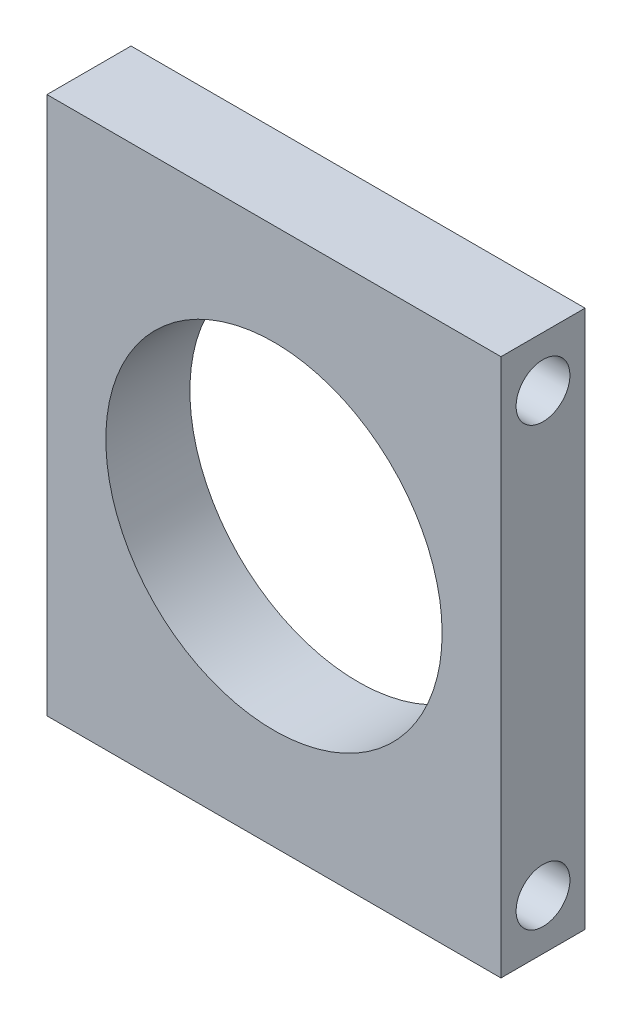
ISO-10303-21;
HEADER;
FILE_DESCRIPTION(('STEP AP214'),'2;1');
FILE_NAME('part.step','',(''),(''),'','','');
FILE_SCHEMA(('AUTOMOTIVE_DESIGN { 1 0 10303 214 1 1 1 1 }'));
ENDSEC;
DATA;
#1=APPLICATION_CONTEXT('core data for automotive mechanical design processes');
#2=APPLICATION_PROTOCOL_DEFINITION('international standard','automotive_design',2000,#1);
#3=PRODUCT_CONTEXT('',#1,'mechanical');
#4=PRODUCT('Part','Part','',(#3));
#5=PRODUCT_RELATED_PRODUCT_CATEGORY('part','',(#4));
#6=PRODUCT_DEFINITION_FORMATION('','',#4);
#7=PRODUCT_DEFINITION_CONTEXT('part definition',#1,'design');
#8=PRODUCT_DEFINITION('design','',#6,#7);
#9=PRODUCT_DEFINITION_SHAPE('','',#8);
#10=(LENGTH_UNIT() NAMED_UNIT(*) SI_UNIT(.MILLI.,.METRE.));
#11=(NAMED_UNIT(*) PLANE_ANGLE_UNIT() SI_UNIT($,.RADIAN.));
#12=(NAMED_UNIT(*) SI_UNIT($,.STERADIAN.) SOLID_ANGLE_UNIT());
#13=UNCERTAINTY_MEASURE_WITH_UNIT(LENGTH_MEASURE(1.E-05),#10,'distance_accuracy_value','');
#14=(GEOMETRIC_REPRESENTATION_CONTEXT(3) GLOBAL_UNCERTAINTY_ASSIGNED_CONTEXT((#13)) GLOBAL_UNIT_ASSIGNED_CONTEXT((#10,
#11,#12)) REPRESENTATION_CONTEXT('',''));
#15=CARTESIAN_POINT('',(0.,0.,0.));
#16=DIRECTION('',(0.,0.,1.));
#17=DIRECTION('',(1.,0.,0.));
#18=AXIS2_PLACEMENT_3D('',#15,#16,#17);
#19=CARTESIAN_POINT('',(0.,0.,5.));
#20=DIRECTION('',(1.,0.,0.));
#21=DIRECTION('',(0.,1.,0.));
#22=AXIS2_PLACEMENT_3D('',#19,#20,#21);
#23=PLANE('',#22);
#24=CARTESIAN_POINT('',(0.,-3.,2.5));
#25=DIRECTION('',(-1.,0.,0.));
#26=DIRECTION('',(0.,-1.,0.));
#27=AXIS2_PLACEMENT_3D('',#24,#25,#26);
#28=CIRCLE('',#27,1.6);
#29=CARTESIAN_POINT('',(0.,-4.6,2.5));
#30=VERTEX_POINT('',#29);
#31=EDGE_CURVE('E117',#30,#30,#28,.T.);
#32=ORIENTED_EDGE('',*,*,#31,.F.);
#33=EDGE_LOOP('',(#32));
#34=FACE_BOUND('',#33,.T.);
#35=CARTESIAN_POINT('',(0.,-29.,2.5));
#36=DIRECTION('',(-1.,0.,0.));
#37=DIRECTION('',(0.,-1.,0.));
#38=AXIS2_PLACEMENT_3D('',#35,#36,#37);
#39=CIRCLE('',#38,1.6);
#40=CARTESIAN_POINT('',(0.,-30.6,2.5));
#41=VERTEX_POINT('',#40);
#42=EDGE_CURVE('E122',#41,#41,#39,.T.);
#43=ORIENTED_EDGE('',*,*,#42,.F.);
#44=EDGE_LOOP('',(#43));
#45=FACE_BOUND('',#44,.T.);
#46=DIRECTION('',(0.,-1.,0.));
#47=VECTOR('',#46,1.);
#48=CARTESIAN_POINT('',(0.,0.,0.));
#49=LINE('',#48,#47);
#50=CARTESIAN_POINT('',(0.,0.,0.));
#51=VERTEX_POINT('',#50);
#52=CARTESIAN_POINT('',(0.,-32.,0.));
#53=VERTEX_POINT('',#52);
#54=EDGE_CURVE('E104',#51,#53,#49,.T.);
#55=ORIENTED_EDGE('',*,*,#54,.T.);
#56=DIRECTION('',(0.,0.,-1.));
#57=VECTOR('',#56,1.);
#58=CARTESIAN_POINT('',(0.,-32.,5.));
#59=LINE('',#58,#57);
#60=CARTESIAN_POINT('',(0.,-32.,5.));
#61=VERTEX_POINT('',#60);
#62=EDGE_CURVE('E11',#61,#53,#59,.T.);
#63=ORIENTED_EDGE('',*,*,#62,.F.);
#64=DIRECTION('',(0.,-1.,0.));
#65=VECTOR('',#64,1.);
#66=CARTESIAN_POINT('',(0.,0.,5.));
#67=LINE('',#66,#65);
#68=CARTESIAN_POINT('',(0.,0.,5.));
#69=VERTEX_POINT('',#68);
#70=EDGE_CURVE('E91',#69,#61,#67,.T.);
#71=ORIENTED_EDGE('',*,*,#70,.F.);
#72=DIRECTION('',(0.,0.,-1.));
#73=VECTOR('',#72,1.);
#74=CARTESIAN_POINT('',(0.,0.,5.));
#75=LINE('',#74,#73);
#76=EDGE_CURVE('E100',#69,#51,#75,.T.);
#77=ORIENTED_EDGE('',*,*,#76,.T.);
#78=EDGE_LOOP('',(#55,#63,#71,#77));
#79=FACE_BOUND('',#78,.T.);
#80=ADVANCED_FACE('F38',(#34,#45,#79),#23,.F.);
#81=CARTESIAN_POINT('',(0.,-32.,5.));
#82=DIRECTION('',(0.,1.,0.));
#83=DIRECTION('',(0.,0.,1.));
#84=AXIS2_PLACEMENT_3D('',#81,#82,#83);
#85=PLANE('',#84);
#86=DIRECTION('',(1.,0.,0.));
#87=VECTOR('',#86,1.);
#88=CARTESIAN_POINT('',(0.,-32.,0.));
#89=LINE('',#88,#87);
#90=CARTESIAN_POINT('',(27.,-32.,0.));
#91=VERTEX_POINT('',#90);
#92=EDGE_CURVE('E95',#53,#91,#89,.T.);
#93=ORIENTED_EDGE('',*,*,#92,.T.);
#94=DIRECTION('',(0.,0.,-1.));
#95=VECTOR('',#94,1.);
#96=CARTESIAN_POINT('',(27.,-32.,5.));
#97=LINE('',#96,#95);
#98=CARTESIAN_POINT('',(27.,-32.,5.));
#99=VERTEX_POINT('',#98);
#100=EDGE_CURVE('E47',#99,#91,#97,.T.);
#101=ORIENTED_EDGE('',*,*,#100,.F.);
#102=DIRECTION('',(1.,0.,0.));
#103=VECTOR('',#102,1.);
#104=CARTESIAN_POINT('',(0.,-32.,5.));
#105=LINE('',#104,#103);
#106=EDGE_CURVE('E86',#61,#99,#105,.T.);
#107=ORIENTED_EDGE('',*,*,#106,.F.);
#108=ORIENTED_EDGE('',*,*,#62,.T.);
#109=EDGE_LOOP('',(#93,#101,#107,#108));
#110=FACE_BOUND('',#109,.T.);
#111=ADVANCED_FACE('F94',(#110),#85,.F.);
#112=CARTESIAN_POINT('',(27.,0.,5.));
#113=DIRECTION('',(-1.,0.,0.));
#114=DIRECTION('',(0.,-1.,0.));
#115=AXIS2_PLACEMENT_3D('',#112,#113,#114);
#116=PLANE('',#115);
#117=CARTESIAN_POINT('',(27.,-3.,2.5));
#118=DIRECTION('',(-1.,0.,0.));
#119=DIRECTION('',(0.,-1.,0.));
#120=AXIS2_PLACEMENT_3D('',#117,#118,#119);
#121=CIRCLE('',#120,1.6);
#122=CARTESIAN_POINT('',(27.,-4.6,2.5));
#123=VERTEX_POINT('',#122);
#124=EDGE_CURVE('E41',#123,#123,#121,.T.);
#125=ORIENTED_EDGE('',*,*,#124,.T.);
#126=EDGE_LOOP('',(#125));
#127=FACE_BOUND('',#126,.T.);
#128=CARTESIAN_POINT('',(27.,-29.,2.5));
#129=DIRECTION('',(-1.,0.,0.));
#130=DIRECTION('',(0.,-1.,0.));
#131=AXIS2_PLACEMENT_3D('',#128,#129,#130);
#132=CIRCLE('',#131,1.6);
#133=CARTESIAN_POINT('',(27.,-30.6,2.5));
#134=VERTEX_POINT('',#133);
#135=EDGE_CURVE('E115',#134,#134,#132,.T.);
#136=ORIENTED_EDGE('',*,*,#135,.T.);
#137=EDGE_LOOP('',(#136));
#138=FACE_BOUND('',#137,.T.);
#139=DIRECTION('',(0.,1.,0.));
#140=VECTOR('',#139,1.);
#141=CARTESIAN_POINT('',(27.,0.,0.));
#142=LINE('',#141,#140);
#143=CARTESIAN_POINT('',(27.,0.,0.));
#144=VERTEX_POINT('',#143);
#145=EDGE_CURVE('E73',#91,#144,#142,.T.);
#146=ORIENTED_EDGE('',*,*,#145,.T.);
#147=DIRECTION('',(0.,0.,-1.));
#148=VECTOR('',#147,1.);
#149=CARTESIAN_POINT('',(27.,0.,5.));
#150=LINE('',#149,#148);
#151=CARTESIAN_POINT('',(27.,0.,5.));
#152=VERTEX_POINT('',#151);
#153=EDGE_CURVE('E96',#152,#144,#150,.T.);
#154=ORIENTED_EDGE('',*,*,#153,.F.);
#155=DIRECTION('',(0.,1.,0.));
#156=VECTOR('',#155,1.);
#157=CARTESIAN_POINT('',(27.,0.,5.));
#158=LINE('',#157,#156);
#159=EDGE_CURVE('E89',#99,#152,#158,.T.);
#160=ORIENTED_EDGE('',*,*,#159,.F.);
#161=ORIENTED_EDGE('',*,*,#100,.T.);
#162=EDGE_LOOP('',(#146,#154,#160,#161));
#163=FACE_BOUND('',#162,.T.);
#164=ADVANCED_FACE('F98',(#127,#138,#163),#116,.F.);
#165=CARTESIAN_POINT('',(0.,0.,5.));
#166=DIRECTION('',(0.,-1.,0.));
#167=DIRECTION('',(0.,0.,-1.));
#168=AXIS2_PLACEMENT_3D('',#165,#166,#167);
#169=PLANE('',#168);
#170=DIRECTION('',(-1.,0.,0.));
#171=VECTOR('',#170,1.);
#172=CARTESIAN_POINT('',(0.,0.,0.));
#173=LINE('',#172,#171);
#174=EDGE_CURVE('E79',#144,#51,#173,.T.);
#175=ORIENTED_EDGE('',*,*,#174,.T.);
#176=ORIENTED_EDGE('',*,*,#76,.F.);
#177=DIRECTION('',(-1.,0.,0.));
#178=VECTOR('',#177,1.);
#179=CARTESIAN_POINT('',(0.,0.,5.));
#180=LINE('',#179,#178);
#181=EDGE_CURVE('E56',#152,#69,#180,.T.);
#182=ORIENTED_EDGE('',*,*,#181,.F.);
#183=ORIENTED_EDGE('',*,*,#153,.T.);
#184=EDGE_LOOP('',(#175,#176,#182,#183));
#185=FACE_BOUND('',#184,.T.);
#186=ADVANCED_FACE('F137',(#185),#169,.F.);
#187=CARTESIAN_POINT('',(0.,0.,5.));
#188=DIRECTION('',(0.,0.,1.));
#189=DIRECTION('',(1.,0.,0.));
#190=AXIS2_PLACEMENT_3D('',#187,#188,#189);
#191=PLANE('',#190);
#192=CARTESIAN_POINT('',(13.5,-16.,5.));
#193=DIRECTION('',(0.,0.,1.));
#194=DIRECTION('',(1.,0.,0.));
#195=AXIS2_PLACEMENT_3D('',#192,#193,#194);
#196=CIRCLE('',#195,10.);
#197=CARTESIAN_POINT('',(23.5,-16.,5.));
#198=VERTEX_POINT('',#197);
#199=EDGE_CURVE('E114',#198,#198,#196,.T.);
#200=ORIENTED_EDGE('',*,*,#199,.F.);
#201=EDGE_LOOP('',(#200));
#202=FACE_BOUND('',#201,.T.);
#203=ORIENTED_EDGE('',*,*,#70,.T.);
#204=ORIENTED_EDGE('',*,*,#106,.T.);
#205=ORIENTED_EDGE('',*,*,#159,.T.);
#206=ORIENTED_EDGE('',*,*,#181,.T.);
#207=EDGE_LOOP('',(#203,#204,#205,#206));
#208=FACE_BOUND('',#207,.T.);
#209=ADVANCED_FACE('F87',(#202,#208),#191,.T.);
#210=CARTESIAN_POINT('',(0.,0.,0.));
#211=DIRECTION('',(0.,0.,1.));
#212=DIRECTION('',(1.,0.,0.));
#213=AXIS2_PLACEMENT_3D('',#210,#211,#212);
#214=PLANE('',#213);
#215=CARTESIAN_POINT('',(13.5,-16.,0.));
#216=DIRECTION('',(0.,0.,1.));
#217=DIRECTION('',(1.,0.,0.));
#218=AXIS2_PLACEMENT_3D('',#215,#216,#217);
#219=CIRCLE('',#218,10.);
#220=CARTESIAN_POINT('',(23.5,-16.,0.));
#221=VERTEX_POINT('',#220);
#222=EDGE_CURVE('E107',#221,#221,#219,.T.);
#223=ORIENTED_EDGE('',*,*,#222,.T.);
#224=EDGE_LOOP('',(#223));
#225=FACE_BOUND('',#224,.T.);
#226=ORIENTED_EDGE('',*,*,#54,.F.);
#227=ORIENTED_EDGE('',*,*,#174,.F.);
#228=ORIENTED_EDGE('',*,*,#145,.F.);
#229=ORIENTED_EDGE('',*,*,#92,.F.);
#230=EDGE_LOOP('',(#226,#227,#228,#229));
#231=FACE_BOUND('',#230,.T.);
#232=ADVANCED_FACE('F136',(#225,#231),#214,.F.);
#233=CARTESIAN_POINT('',(13.5,-16.,-59.));
#234=DIRECTION('',(0.,0.,1.));
#235=DIRECTION('',(1.,0.,0.));
#236=AXIS2_PLACEMENT_3D('',#233,#234,#235);
#237=CYLINDRICAL_SURFACE('',#236,10.);
#238=ORIENTED_EDGE('',*,*,#199,.T.);
#239=EDGE_LOOP('',(#238));
#240=FACE_BOUND('',#239,.T.);
#241=ORIENTED_EDGE('',*,*,#222,.F.);
#242=EDGE_LOOP('',(#241));
#243=FACE_BOUND('',#242,.T.);
#244=ADVANCED_FACE('F132',(#240,#243),#237,.F.);
#245=CARTESIAN_POINT('',(64.,-29.,2.5));
#246=DIRECTION('',(-1.,0.,0.));
#247=DIRECTION('',(0.,-1.,0.));
#248=AXIS2_PLACEMENT_3D('',#245,#246,#247);
#249=CYLINDRICAL_SURFACE('',#248,1.6);
#250=ORIENTED_EDGE('',*,*,#42,.T.);
#251=EDGE_LOOP('',(#250));
#252=FACE_BOUND('',#251,.T.);
#253=ORIENTED_EDGE('',*,*,#135,.F.);
#254=EDGE_LOOP('',(#253));
#255=FACE_BOUND('',#254,.T.);
#256=ADVANCED_FACE('F158',(#252,#255),#249,.F.);
#257=CARTESIAN_POINT('',(64.,-2.99999999999999,2.5));
#258=DIRECTION('',(-1.,0.,0.));
#259=DIRECTION('',(0.,-1.,0.));
#260=AXIS2_PLACEMENT_3D('',#257,#258,#259);
#261=CYLINDRICAL_SURFACE('',#260,1.6);
#262=ORIENTED_EDGE('',*,*,#31,.T.);
#263=EDGE_LOOP('',(#262));
#264=FACE_BOUND('',#263,.T.);
#265=ORIENTED_EDGE('',*,*,#124,.F.);
#266=EDGE_LOOP('',(#265));
#267=FACE_BOUND('',#266,.T.);
#268=ADVANCED_FACE('F161',(#264,#267),#261,.F.);
#269=CLOSED_SHELL('',(#80,#111,#164,#186,#209,#232,#244,#256,#268));
#270=MANIFOLD_SOLID_BREP('B2',#269);
#271=ADVANCED_BREP_SHAPE_REPRESENTATION('',(#18,#270),#14);
#272=SHAPE_DEFINITION_REPRESENTATION(#9,#271);
ENDSEC;
END-ISO-10303-21;
